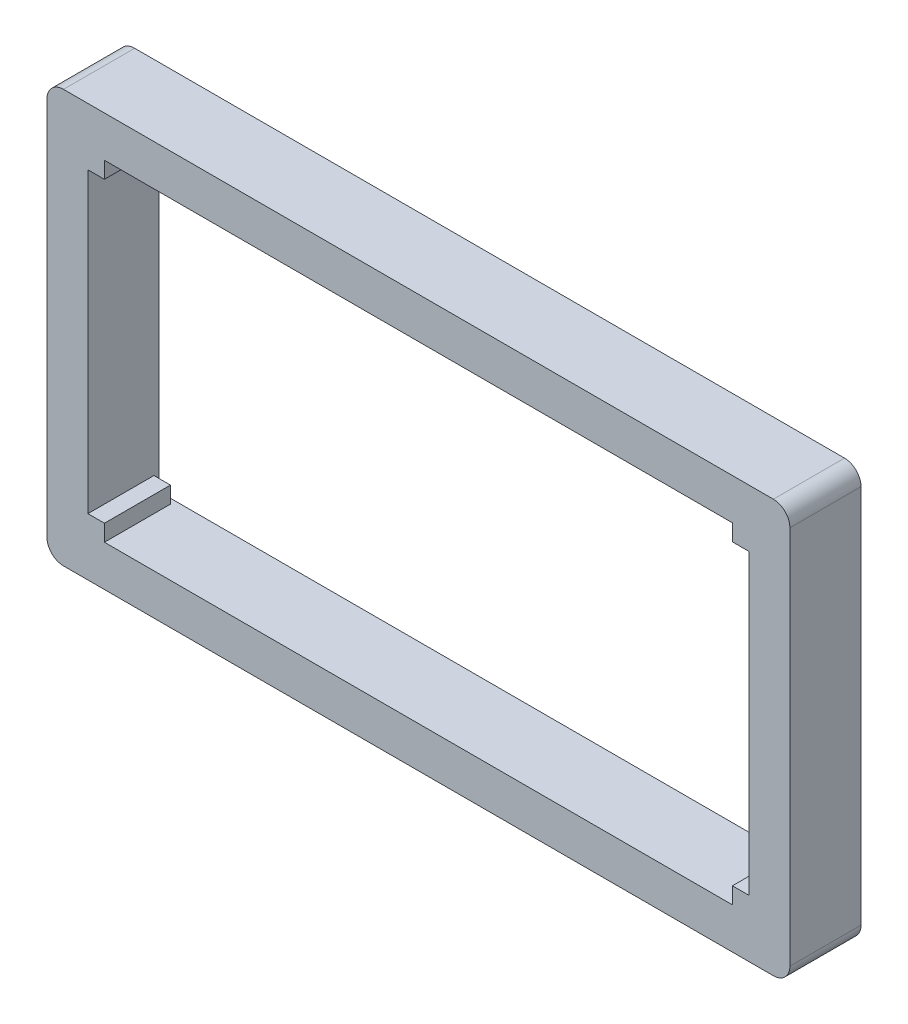
ISO-10303-21;
HEADER;
FILE_DESCRIPTION(('STEP AP214'),'2;1');
FILE_NAME('part.step','',(''),(''),'','','');
FILE_SCHEMA(('AUTOMOTIVE_DESIGN { 1 0 10303 214 1 1 1 1 }'));
ENDSEC;
DATA;
#1=APPLICATION_CONTEXT('core data for automotive mechanical design processes');
#2=APPLICATION_PROTOCOL_DEFINITION('international standard','automotive_design',2000,#1);
#3=PRODUCT_CONTEXT('',#1,'mechanical');
#4=PRODUCT('Part','Part','',(#3));
#5=PRODUCT_RELATED_PRODUCT_CATEGORY('part','',(#4));
#6=PRODUCT_DEFINITION_FORMATION('','',#4);
#7=PRODUCT_DEFINITION_CONTEXT('part definition',#1,'design');
#8=PRODUCT_DEFINITION('design','',#6,#7);
#9=PRODUCT_DEFINITION_SHAPE('','',#8);
#10=(LENGTH_UNIT() NAMED_UNIT(*) SI_UNIT(.MILLI.,.METRE.));
#11=(NAMED_UNIT(*) PLANE_ANGLE_UNIT() SI_UNIT($,.RADIAN.));
#12=(NAMED_UNIT(*) SI_UNIT($,.STERADIAN.) SOLID_ANGLE_UNIT());
#13=UNCERTAINTY_MEASURE_WITH_UNIT(LENGTH_MEASURE(1.E-05),#10,'distance_accuracy_value','');
#14=(GEOMETRIC_REPRESENTATION_CONTEXT(3) GLOBAL_UNCERTAINTY_ASSIGNED_CONTEXT((#13)) GLOBAL_UNIT_ASSIGNED_CONTEXT((#10,
#11,#12)) REPRESENTATION_CONTEXT('',''));
#15=CARTESIAN_POINT('',(0.,0.,0.));
#16=DIRECTION('',(0.,0.,1.));
#17=DIRECTION('',(1.,0.,0.));
#18=AXIS2_PLACEMENT_3D('',#15,#16,#17);
#19=CARTESIAN_POINT('',(0.,0.,0.));
#20=DIRECTION('',(0.,0.,1.));
#21=DIRECTION('',(1.,0.,0.));
#22=AXIS2_PLACEMENT_3D('',#19,#20,#21);
#23=PLANE('',#22);
#24=DIRECTION('',(1.,0.,0.));
#25=VECTOR('',#24,1.);
#26=CARTESIAN_POINT('',(-12.4,-12.4,0.));
#27=LINE('',#26,#25);
#28=CARTESIAN_POINT('',(-7.4,-12.4,0.));
#29=VERTEX_POINT('',#28);
#30=CARTESIAN_POINT('',(207.6,-12.4,0.));
#31=VERTEX_POINT('',#30);
#32=EDGE_CURVE('E397',#29,#31,#27,.T.);
#33=ORIENTED_EDGE('',*,*,#32,.F.);
#34=CARTESIAN_POINT('',(-7.4,-7.4,0.));
#35=DIRECTION('',(0.,0.,1.));
#36=DIRECTION('',(1.,0.,0.));
#37=AXIS2_PLACEMENT_3D('',#34,#35,#36);
#38=CIRCLE('',#37,5.);
#39=CARTESIAN_POINT('',(-12.4,-7.4,0.));
#40=VERTEX_POINT('',#39);
#41=EDGE_CURVE('E418',#29,#40,#38,.F.);
#42=ORIENTED_EDGE('',*,*,#41,.T.);
#43=DIRECTION('',(0.,-1.,0.));
#44=VECTOR('',#43,1.);
#45=CARTESIAN_POINT('',(-12.4,112.6,0.));
#46=LINE('',#45,#44);
#47=CARTESIAN_POINT('',(-12.4,107.6,0.));
#48=VERTEX_POINT('',#47);
#49=EDGE_CURVE('E391',#48,#40,#46,.T.);
#50=ORIENTED_EDGE('',*,*,#49,.F.);
#51=CARTESIAN_POINT('',(-7.4,107.6,0.));
#52=DIRECTION('',(0.,0.,1.));
#53=DIRECTION('',(1.,0.,0.));
#54=AXIS2_PLACEMENT_3D('',#51,#52,#53);
#55=CIRCLE('',#54,5.);
#56=CARTESIAN_POINT('',(-7.4,112.6,0.));
#57=VERTEX_POINT('',#56);
#58=EDGE_CURVE('E412',#48,#57,#55,.F.);
#59=ORIENTED_EDGE('',*,*,#58,.T.);
#60=DIRECTION('',(-1.,0.,0.));
#61=VECTOR('',#60,1.);
#62=CARTESIAN_POINT('',(-12.4,112.6,0.));
#63=LINE('',#62,#61);
#64=CARTESIAN_POINT('',(207.6,112.6,0.));
#65=VERTEX_POINT('',#64);
#66=EDGE_CURVE('E405',#65,#57,#63,.T.);
#67=ORIENTED_EDGE('',*,*,#66,.F.);
#68=CARTESIAN_POINT('',(207.6,107.6,0.));
#69=DIRECTION('',(0.,0.,1.));
#70=DIRECTION('',(1.,0.,0.));
#71=AXIS2_PLACEMENT_3D('',#68,#69,#70);
#72=CIRCLE('',#71,5.);
#73=CARTESIAN_POINT('',(212.6,107.6,0.));
#74=VERTEX_POINT('',#73);
#75=EDGE_CURVE('E408',#65,#74,#72,.F.);
#76=ORIENTED_EDGE('',*,*,#75,.T.);
#77=DIRECTION('',(0.,1.,0.));
#78=VECTOR('',#77,1.);
#79=CARTESIAN_POINT('',(212.6,112.6,0.));
#80=LINE('',#79,#78);
#81=CARTESIAN_POINT('',(212.6,-7.40000000000002,0.));
#82=VERTEX_POINT('',#81);
#83=EDGE_CURVE('E400',#82,#74,#80,.T.);
#84=ORIENTED_EDGE('',*,*,#83,.F.);
#85=CARTESIAN_POINT('',(207.6,-7.40000000000002,0.));
#86=DIRECTION('',(0.,0.,1.));
#87=DIRECTION('',(1.,0.,0.));
#88=AXIS2_PLACEMENT_3D('',#85,#86,#87);
#89=CIRCLE('',#88,5.);
#90=EDGE_CURVE('E413',#82,#31,#89,.F.);
#91=ORIENTED_EDGE('',*,*,#90,.T.);
#92=EDGE_LOOP('',(#33,#42,#50,#59,#67,#76,#84,#91));
#93=FACE_BOUND('',#92,.T.);
#94=DIRECTION('',(0.,-1.,0.));
#95=VECTOR('',#94,1.);
#96=CARTESIAN_POINT('',(0.,0.,0.));
#97=LINE('',#96,#95);
#98=CARTESIAN_POINT('',(0.,100.2,0.));
#99=VERTEX_POINT('',#98);
#100=CARTESIAN_POINT('',(0.,0.,0.));
#101=VERTEX_POINT('',#100);
#102=EDGE_CURVE('E329',#99,#101,#97,.T.);
#103=ORIENTED_EDGE('',*,*,#102,.T.);
#104=DIRECTION('',(1.,0.,0.));
#105=VECTOR('',#104,1.);
#106=CARTESIAN_POINT('',(0.,0.,0.));
#107=LINE('',#106,#105);
#108=CARTESIAN_POINT('',(200.2,0.,0.));
#109=VERTEX_POINT('',#108);
#110=EDGE_CURVE('E376',#101,#109,#107,.T.);
#111=ORIENTED_EDGE('',*,*,#110,.T.);
#112=DIRECTION('',(0.,1.,0.));
#113=VECTOR('',#112,1.);
#114=CARTESIAN_POINT('',(200.2,0.,0.));
#115=LINE('',#114,#113);
#116=CARTESIAN_POINT('',(200.2,100.2,0.));
#117=VERTEX_POINT('',#116);
#118=EDGE_CURVE('E377',#109,#117,#115,.T.);
#119=ORIENTED_EDGE('',*,*,#118,.T.);
#120=DIRECTION('',(-1.,0.,0.));
#121=VECTOR('',#120,1.);
#122=CARTESIAN_POINT('',(0.,100.2,0.));
#123=LINE('',#122,#121);
#124=EDGE_CURVE('E385',#117,#99,#123,.T.);
#125=ORIENTED_EDGE('',*,*,#124,.T.);
#126=EDGE_LOOP('',(#103,#111,#119,#125));
#127=FACE_BOUND('',#126,.T.);
#128=ADVANCED_FACE('F90',(#93,#127),#23,.F.);
#129=CARTESIAN_POINT('',(-12.4,112.6,1.55));
#130=DIRECTION('',(1.,0.,0.));
#131=DIRECTION('',(0.,0.,-1.));
#132=AXIS2_PLACEMENT_3D('',#129,#130,#131);
#133=PLANE('',#132);
#134=ORIENTED_EDGE('',*,*,#49,.T.);
#135=DIRECTION('',(0.,0.,-1.));
#136=VECTOR('',#135,1.);
#137=CARTESIAN_POINT('',(-12.4,-7.4,1.55));
#138=LINE('',#137,#136);
#139=CARTESIAN_POINT('',(-12.4,-7.4,21.55));
#140=VERTEX_POINT('',#139);
#141=EDGE_CURVE('E423',#40,#140,#138,.F.);
#142=ORIENTED_EDGE('',*,*,#141,.T.);
#143=DIRECTION('',(0.,-1.,0.));
#144=VECTOR('',#143,1.);
#145=CARTESIAN_POINT('',(-12.4,0.,21.55));
#146=LINE('',#145,#144);
#147=CARTESIAN_POINT('',(-12.4,107.6,21.55));
#148=VERTEX_POINT('',#147);
#149=EDGE_CURVE('E296',#148,#140,#146,.T.);
#150=ORIENTED_EDGE('',*,*,#149,.F.);
#151=DIRECTION('',(0.,0.,-1.));
#152=VECTOR('',#151,1.);
#153=CARTESIAN_POINT('',(-12.4,107.6,1.55));
#154=LINE('',#153,#152);
#155=EDGE_CURVE('E416',#148,#48,#154,.T.);
#156=ORIENTED_EDGE('',*,*,#155,.T.);
#157=EDGE_LOOP('',(#134,#142,#150,#156));
#158=FACE_BOUND('',#157,.T.);
#159=ADVANCED_FACE('F454',(#158),#133,.F.);
#160=CARTESIAN_POINT('',(-12.4,-12.4,1.55));
#161=DIRECTION('',(0.,1.,0.));
#162=DIRECTION('',(-1.,0.,0.));
#163=AXIS2_PLACEMENT_3D('',#160,#161,#162);
#164=PLANE('',#163);
#165=DIRECTION('',(1.,0.,0.));
#166=VECTOR('',#165,1.);
#167=CARTESIAN_POINT('',(0.,-12.4,21.55));
#168=LINE('',#167,#166);
#169=CARTESIAN_POINT('',(-7.4,-12.4,21.55));
#170=VERTEX_POINT('',#169);
#171=CARTESIAN_POINT('',(207.6,-12.4,21.55));
#172=VERTEX_POINT('',#171);
#173=EDGE_CURVE('E302',#170,#172,#168,.T.);
#174=ORIENTED_EDGE('',*,*,#173,.F.);
#175=DIRECTION('',(0.,0.,-1.));
#176=VECTOR('',#175,1.);
#177=CARTESIAN_POINT('',(-7.4,-12.4,1.55));
#178=LINE('',#177,#176);
#179=EDGE_CURVE('E410',#170,#29,#178,.T.);
#180=ORIENTED_EDGE('',*,*,#179,.T.);
#181=ORIENTED_EDGE('',*,*,#32,.T.);
#182=DIRECTION('',(0.,0.,-1.));
#183=VECTOR('',#182,1.);
#184=CARTESIAN_POINT('',(207.6,-12.4,1.55));
#185=LINE('',#184,#183);
#186=EDGE_CURVE('E403',#31,#172,#185,.F.);
#187=ORIENTED_EDGE('',*,*,#186,.T.);
#188=EDGE_LOOP('',(#174,#180,#181,#187));
#189=FACE_BOUND('',#188,.T.);
#190=ADVANCED_FACE('F462',(#189),#164,.F.);
#191=CARTESIAN_POINT('',(212.6,112.6,1.55));
#192=DIRECTION('',(-1.,0.,0.));
#193=DIRECTION('',(0.,0.,1.));
#194=AXIS2_PLACEMENT_3D('',#191,#192,#193);
#195=PLANE('',#194);
#196=DIRECTION('',(0.,1.,0.));
#197=VECTOR('',#196,1.);
#198=CARTESIAN_POINT('',(212.6,0.,21.55));
#199=LINE('',#198,#197);
#200=CARTESIAN_POINT('',(212.6,-7.40000000000002,21.55));
#201=VERTEX_POINT('',#200);
#202=CARTESIAN_POINT('',(212.6,107.6,21.55));
#203=VERTEX_POINT('',#202);
#204=EDGE_CURVE('E303',#201,#203,#199,.T.);
#205=ORIENTED_EDGE('',*,*,#204,.F.);
#206=DIRECTION('',(0.,0.,-1.));
#207=VECTOR('',#206,1.);
#208=CARTESIAN_POINT('',(212.6,-7.40000000000002,1.55));
#209=LINE('',#208,#207);
#210=EDGE_CURVE('E431',#201,#82,#209,.T.);
#211=ORIENTED_EDGE('',*,*,#210,.T.);
#212=ORIENTED_EDGE('',*,*,#83,.T.);
#213=DIRECTION('',(0.,0.,-1.));
#214=VECTOR('',#213,1.);
#215=CARTESIAN_POINT('',(212.6,107.6,1.55));
#216=LINE('',#215,#214);
#217=EDGE_CURVE('E102',#74,#203,#216,.F.);
#218=ORIENTED_EDGE('',*,*,#217,.T.);
#219=EDGE_LOOP('',(#205,#211,#212,#218));
#220=FACE_BOUND('',#219,.T.);
#221=ADVANCED_FACE('F466',(#220),#195,.F.);
#222=CARTESIAN_POINT('',(-12.4,112.6,1.55));
#223=DIRECTION('',(0.,-1.,0.));
#224=DIRECTION('',(1.,0.,0.));
#225=AXIS2_PLACEMENT_3D('',#222,#223,#224);
#226=PLANE('',#225);
#227=ORIENTED_EDGE('',*,*,#66,.T.);
#228=DIRECTION('',(0.,0.,-1.));
#229=VECTOR('',#228,1.);
#230=CARTESIAN_POINT('',(-7.4,112.6,1.55));
#231=LINE('',#230,#229);
#232=CARTESIAN_POINT('',(-7.4,112.6,21.55));
#233=VERTEX_POINT('',#232);
#234=EDGE_CURVE('E12',#57,#233,#231,.F.);
#235=ORIENTED_EDGE('',*,*,#234,.T.);
#236=DIRECTION('',(-1.,0.,0.));
#237=VECTOR('',#236,1.);
#238=CARTESIAN_POINT('',(0.,112.6,21.55));
#239=LINE('',#238,#237);
#240=CARTESIAN_POINT('',(207.6,112.6,21.55));
#241=VERTEX_POINT('',#240);
#242=EDGE_CURVE('E297',#241,#233,#239,.T.);
#243=ORIENTED_EDGE('',*,*,#242,.F.);
#244=DIRECTION('',(0.,0.,-1.));
#245=VECTOR('',#244,1.);
#246=CARTESIAN_POINT('',(207.6,112.6,1.55));
#247=LINE('',#246,#245);
#248=EDGE_CURVE('E100',#241,#65,#247,.T.);
#249=ORIENTED_EDGE('',*,*,#248,.T.);
#250=EDGE_LOOP('',(#227,#235,#243,#249));
#251=FACE_BOUND('',#250,.T.);
#252=ADVANCED_FACE('F437',(#251),#226,.F.);
#253=CARTESIAN_POINT('',(0.,0.,1.55));
#254=DIRECTION('',(1.,0.,0.));
#255=DIRECTION('',(0.,0.,-1.));
#256=AXIS2_PLACEMENT_3D('',#253,#254,#255);
#257=PLANE('',#256);
#258=ORIENTED_EDGE('',*,*,#102,.F.);
#259=DIRECTION('',(0.,0.,-1.));
#260=VECTOR('',#259,1.);
#261=CARTESIAN_POINT('',(0.,100.2,1.55));
#262=LINE('',#261,#260);
#263=CARTESIAN_POINT('',(0.,100.2,1.55));
#264=VERTEX_POINT('',#263);
#265=EDGE_CURVE('E373',#264,#99,#262,.T.);
#266=ORIENTED_EDGE('',*,*,#265,.F.);
#267=DIRECTION('',(0.,-1.,0.));
#268=VECTOR('',#267,1.);
#269=CARTESIAN_POINT('',(0.,0.,1.55));
#270=LINE('',#269,#268);
#271=CARTESIAN_POINT('',(0.,95.2,1.55));
#272=VERTEX_POINT('',#271);
#273=EDGE_CURVE('E359',#264,#272,#270,.T.);
#274=ORIENTED_EDGE('',*,*,#273,.T.);
#275=DIRECTION('',(0.,0.,-1.));
#276=VECTOR('',#275,1.);
#277=CARTESIAN_POINT('',(0.,95.2,21.55));
#278=LINE('',#277,#276);
#279=CARTESIAN_POINT('',(0.,95.2,21.55));
#280=VERTEX_POINT('',#279);
#281=EDGE_CURVE('E323',#280,#272,#278,.T.);
#282=ORIENTED_EDGE('',*,*,#281,.F.);
#283=DIRECTION('',(0.,1.,0.));
#284=VECTOR('',#283,1.);
#285=CARTESIAN_POINT('',(0.,0.,21.55));
#286=LINE('',#285,#284);
#287=CARTESIAN_POINT('',(0.,4.99999999999998,21.55));
#288=VERTEX_POINT('',#287);
#289=EDGE_CURVE('E290',#288,#280,#286,.T.);
#290=ORIENTED_EDGE('',*,*,#289,.F.);
#291=DIRECTION('',(0.,0.,-1.));
#292=VECTOR('',#291,1.);
#293=CARTESIAN_POINT('',(0.,4.99999999999998,21.55));
#294=LINE('',#293,#292);
#295=CARTESIAN_POINT('',(0.,4.99999999999998,1.55));
#296=VERTEX_POINT('',#295);
#297=EDGE_CURVE('E324',#288,#296,#294,.T.);
#298=ORIENTED_EDGE('',*,*,#297,.T.);
#299=CARTESIAN_POINT('',(0.,0.,1.55));
#300=VERTEX_POINT('',#299);
#301=EDGE_CURVE('E362',#296,#300,#270,.T.);
#302=ORIENTED_EDGE('',*,*,#301,.T.);
#303=DIRECTION('',(0.,0.,-1.));
#304=VECTOR('',#303,1.);
#305=CARTESIAN_POINT('',(0.,0.,1.55));
#306=LINE('',#305,#304);
#307=EDGE_CURVE('E392',#300,#101,#306,.T.);
#308=ORIENTED_EDGE('',*,*,#307,.T.);
#309=EDGE_LOOP('',(#258,#266,#274,#282,#290,#298,#302,#308));
#310=FACE_BOUND('',#309,.T.);
#311=ADVANCED_FACE('F477',(#310),#257,.T.);
#312=CARTESIAN_POINT('',(0.,0.,1.55));
#313=DIRECTION('',(0.,1.,0.));
#314=DIRECTION('',(0.,0.,1.));
#315=AXIS2_PLACEMENT_3D('',#312,#313,#314);
#316=PLANE('',#315);
#317=ORIENTED_EDGE('',*,*,#110,.F.);
#318=ORIENTED_EDGE('',*,*,#307,.F.);
#319=DIRECTION('',(1.,0.,0.));
#320=VECTOR('',#319,1.);
#321=CARTESIAN_POINT('',(0.,0.,1.55));
#322=LINE('',#321,#320);
#323=CARTESIAN_POINT('',(5.00000000000002,0.,1.55));
#324=VERTEX_POINT('',#323);
#325=EDGE_CURVE('E361',#300,#324,#322,.T.);
#326=ORIENTED_EDGE('',*,*,#325,.T.);
#327=DIRECTION('',(0.,0.,-1.));
#328=VECTOR('',#327,1.);
#329=CARTESIAN_POINT('',(5.00000000000002,0.,21.55));
#330=LINE('',#329,#328);
#331=CARTESIAN_POINT('',(5.00000000000003,0.,21.55));
#332=VERTEX_POINT('',#331);
#333=EDGE_CURVE('E327',#332,#324,#330,.T.);
#334=ORIENTED_EDGE('',*,*,#333,.F.);
#335=DIRECTION('',(-1.,0.,0.));
#336=VECTOR('',#335,1.);
#337=CARTESIAN_POINT('',(0.,0.,21.55));
#338=LINE('',#337,#336);
#339=CARTESIAN_POINT('',(195.2,0.,21.55));
#340=VERTEX_POINT('',#339);
#341=EDGE_CURVE('E287',#340,#332,#338,.T.);
#342=ORIENTED_EDGE('',*,*,#341,.F.);
#343=DIRECTION('',(0.,0.,-1.));
#344=VECTOR('',#343,1.);
#345=CARTESIAN_POINT('',(195.2,0.,21.55));
#346=LINE('',#345,#344);
#347=CARTESIAN_POINT('',(195.2,0.,1.55));
#348=VERTEX_POINT('',#347);
#349=EDGE_CURVE('E320',#340,#348,#346,.T.);
#350=ORIENTED_EDGE('',*,*,#349,.T.);
#351=CARTESIAN_POINT('',(200.2,0.,1.55));
#352=VERTEX_POINT('',#351);
#353=EDGE_CURVE('E363',#348,#352,#322,.T.);
#354=ORIENTED_EDGE('',*,*,#353,.T.);
#355=DIRECTION('',(0.,0.,-1.));
#356=VECTOR('',#355,1.);
#357=CARTESIAN_POINT('',(200.2,0.,1.55));
#358=LINE('',#357,#356);
#359=EDGE_CURVE('E386',#352,#109,#358,.T.);
#360=ORIENTED_EDGE('',*,*,#359,.T.);
#361=EDGE_LOOP('',(#317,#318,#326,#334,#342,#350,#354,#360));
#362=FACE_BOUND('',#361,.T.);
#363=ADVANCED_FACE('F647',(#362),#316,.T.);
#364=CARTESIAN_POINT('',(200.2,0.,1.55));
#365=DIRECTION('',(-1.,0.,0.));
#366=DIRECTION('',(0.,0.,1.));
#367=AXIS2_PLACEMENT_3D('',#364,#365,#366);
#368=PLANE('',#367);
#369=ORIENTED_EDGE('',*,*,#118,.F.);
#370=ORIENTED_EDGE('',*,*,#359,.F.);
#371=DIRECTION('',(0.,1.,0.));
#372=VECTOR('',#371,1.);
#373=CARTESIAN_POINT('',(200.2,0.,1.55));
#374=LINE('',#373,#372);
#375=CARTESIAN_POINT('',(200.2,5.,1.55));
#376=VERTEX_POINT('',#375);
#377=EDGE_CURVE('E370',#352,#376,#374,.T.);
#378=ORIENTED_EDGE('',*,*,#377,.T.);
#379=DIRECTION('',(0.,0.,-1.));
#380=VECTOR('',#379,1.);
#381=CARTESIAN_POINT('',(200.2,5.,21.55));
#382=LINE('',#381,#380);
#383=CARTESIAN_POINT('',(200.2,5.,21.55));
#384=VERTEX_POINT('',#383);
#385=EDGE_CURVE('E265',#384,#376,#382,.T.);
#386=ORIENTED_EDGE('',*,*,#385,.F.);
#387=DIRECTION('',(0.,-1.,0.));
#388=VECTOR('',#387,1.);
#389=CARTESIAN_POINT('',(200.2,0.,21.55));
#390=LINE('',#389,#388);
#391=CARTESIAN_POINT('',(200.2,95.2,21.55));
#392=VERTEX_POINT('',#391);
#393=EDGE_CURVE('E264',#392,#384,#390,.T.);
#394=ORIENTED_EDGE('',*,*,#393,.F.);
#395=DIRECTION('',(0.,0.,-1.));
#396=VECTOR('',#395,1.);
#397=CARTESIAN_POINT('',(200.2,95.2,21.55));
#398=LINE('',#397,#396);
#399=CARTESIAN_POINT('',(200.2,95.2,1.55));
#400=VERTEX_POINT('',#399);
#401=EDGE_CURVE('E252',#392,#400,#398,.T.);
#402=ORIENTED_EDGE('',*,*,#401,.T.);
#403=CARTESIAN_POINT('',(200.2,100.2,1.55));
#404=VERTEX_POINT('',#403);
#405=EDGE_CURVE('E368',#400,#404,#374,.T.);
#406=ORIENTED_EDGE('',*,*,#405,.T.);
#407=DIRECTION('',(0.,0.,-1.));
#408=VECTOR('',#407,1.);
#409=CARTESIAN_POINT('',(200.2,100.2,1.55));
#410=LINE('',#409,#408);
#411=EDGE_CURVE('E390',#404,#117,#410,.T.);
#412=ORIENTED_EDGE('',*,*,#411,.T.);
#413=EDGE_LOOP('',(#369,#370,#378,#386,#394,#402,#406,#412));
#414=FACE_BOUND('',#413,.T.);
#415=ADVANCED_FACE('F270',(#414),#368,.T.);
#416=CARTESIAN_POINT('',(0.,100.2,1.55));
#417=DIRECTION('',(0.,-1.,0.));
#418=DIRECTION('',(0.,0.,-1.));
#419=AXIS2_PLACEMENT_3D('',#416,#417,#418);
#420=PLANE('',#419);
#421=ORIENTED_EDGE('',*,*,#124,.F.);
#422=ORIENTED_EDGE('',*,*,#411,.F.);
#423=DIRECTION('',(-1.,0.,0.));
#424=VECTOR('',#423,1.);
#425=CARTESIAN_POINT('',(0.,100.2,1.55));
#426=LINE('',#425,#424);
#427=CARTESIAN_POINT('',(195.2,100.2,1.55));
#428=VERTEX_POINT('',#427);
#429=EDGE_CURVE('E367',#404,#428,#426,.T.);
#430=ORIENTED_EDGE('',*,*,#429,.T.);
#431=DIRECTION('',(0.,0.,-1.));
#432=VECTOR('',#431,1.);
#433=CARTESIAN_POINT('',(195.2,100.2,21.55));
#434=LINE('',#433,#432);
#435=CARTESIAN_POINT('',(195.2,100.2,21.55));
#436=VERTEX_POINT('',#435);
#437=EDGE_CURVE('E312',#436,#428,#434,.T.);
#438=ORIENTED_EDGE('',*,*,#437,.F.);
#439=DIRECTION('',(1.,0.,0.));
#440=VECTOR('',#439,1.);
#441=CARTESIAN_POINT('',(0.,100.2,21.55));
#442=LINE('',#441,#440);
#443=CARTESIAN_POINT('',(5.00000000000001,100.2,21.55));
#444=VERTEX_POINT('',#443);
#445=EDGE_CURVE('E291',#444,#436,#442,.T.);
#446=ORIENTED_EDGE('',*,*,#445,.F.);
#447=DIRECTION('',(0.,0.,-1.));
#448=VECTOR('',#447,1.);
#449=CARTESIAN_POINT('',(5.00000000000001,100.2,21.55));
#450=LINE('',#449,#448);
#451=CARTESIAN_POINT('',(5.00000000000001,100.2,1.55));
#452=VERTEX_POINT('',#451);
#453=EDGE_CURVE('E261',#444,#452,#450,.T.);
#454=ORIENTED_EDGE('',*,*,#453,.T.);
#455=EDGE_CURVE('E369',#452,#264,#426,.T.);
#456=ORIENTED_EDGE('',*,*,#455,.T.);
#457=ORIENTED_EDGE('',*,*,#265,.T.);
#458=EDGE_LOOP('',(#421,#422,#430,#438,#446,#454,#456,#457));
#459=FACE_BOUND('',#458,.T.);
#460=ADVANCED_FACE('F626',(#459),#420,.T.);
#461=CARTESIAN_POINT('',(0.,0.,1.55));
#462=DIRECTION('',(0.,0.,1.));
#463=DIRECTION('',(1.,0.,0.));
#464=AXIS2_PLACEMENT_3D('',#461,#462,#463);
#465=PLANE('',#464);
#466=ORIENTED_EDGE('',*,*,#325,.F.);
#467=ORIENTED_EDGE('',*,*,#301,.F.);
#468=DIRECTION('',(1.,0.,0.));
#469=VECTOR('',#468,1.);
#470=CARTESIAN_POINT('',(0.,4.99999999999998,1.55));
#471=LINE('',#470,#469);
#472=CARTESIAN_POINT('',(5.00000000000003,4.99999999999998,1.55));
#473=VERTEX_POINT('',#472);
#474=EDGE_CURVE('E340',#296,#473,#471,.T.);
#475=ORIENTED_EDGE('',*,*,#474,.T.);
#476=DIRECTION('',(0.,1.,0.));
#477=VECTOR('',#476,1.);
#478=CARTESIAN_POINT('',(5.00000000000002,0.,1.55));
#479=LINE('',#478,#477);
#480=EDGE_CURVE('E333',#324,#473,#479,.T.);
#481=ORIENTED_EDGE('',*,*,#480,.F.);
#482=EDGE_LOOP('',(#466,#467,#475,#481));
#483=FACE_BOUND('',#482,.T.);
#484=ADVANCED_FACE('F566',(#483),#465,.F.);
#485=ORIENTED_EDGE('',*,*,#273,.F.);
#486=ORIENTED_EDGE('',*,*,#455,.F.);
#487=DIRECTION('',(0.,-1.,0.));
#488=VECTOR('',#487,1.);
#489=CARTESIAN_POINT('',(5.00000000000001,100.2,1.55));
#490=LINE('',#489,#488);
#491=CARTESIAN_POINT('',(5.00000000000001,95.2,1.55));
#492=VERTEX_POINT('',#491);
#493=EDGE_CURVE('E350',#452,#492,#490,.T.);
#494=ORIENTED_EDGE('',*,*,#493,.T.);
#495=DIRECTION('',(1.,0.,0.));
#496=VECTOR('',#495,1.);
#497=CARTESIAN_POINT('',(0.,95.2,1.55));
#498=LINE('',#497,#496);
#499=EDGE_CURVE('E348',#272,#492,#498,.T.);
#500=ORIENTED_EDGE('',*,*,#499,.F.);
#501=EDGE_LOOP('',(#485,#486,#494,#500));
#502=FACE_BOUND('',#501,.T.);
#503=ADVANCED_FACE('F608',(#502),#465,.F.);
#504=ORIENTED_EDGE('',*,*,#353,.F.);
#505=DIRECTION('',(0.,1.,0.));
#506=VECTOR('',#505,1.);
#507=CARTESIAN_POINT('',(195.2,0.,1.55));
#508=LINE('',#507,#506);
#509=CARTESIAN_POINT('',(195.2,5.,1.55));
#510=VERTEX_POINT('',#509);
#511=EDGE_CURVE('E278',#348,#510,#508,.T.);
#512=ORIENTED_EDGE('',*,*,#511,.T.);
#513=DIRECTION('',(-1.,0.,0.));
#514=VECTOR('',#513,1.);
#515=CARTESIAN_POINT('',(0.,5.,1.55));
#516=LINE('',#515,#514);
#517=EDGE_CURVE('E306',#376,#510,#516,.T.);
#518=ORIENTED_EDGE('',*,*,#517,.F.);
#519=ORIENTED_EDGE('',*,*,#377,.F.);
#520=EDGE_LOOP('',(#504,#512,#518,#519));
#521=FACE_BOUND('',#520,.T.);
#522=ADVANCED_FACE('F548',(#521),#465,.F.);
#523=CARTESIAN_POINT('',(0.,5.,21.55));
#524=DIRECTION('',(0.,-1.,0.));
#525=DIRECTION('',(0.,0.,-1.));
#526=AXIS2_PLACEMENT_3D('',#523,#524,#525);
#527=PLANE('',#526);
#528=ORIENTED_EDGE('',*,*,#517,.T.);
#529=DIRECTION('',(0.,0.,-1.));
#530=VECTOR('',#529,1.);
#531=CARTESIAN_POINT('',(195.2,5.,21.55));
#532=LINE('',#531,#530);
#533=CARTESIAN_POINT('',(195.2,5.,21.55));
#534=VERTEX_POINT('',#533);
#535=EDGE_CURVE('E319',#534,#510,#532,.T.);
#536=ORIENTED_EDGE('',*,*,#535,.F.);
#537=DIRECTION('',(-1.,0.,0.));
#538=VECTOR('',#537,1.);
#539=CARTESIAN_POINT('',(0.,5.,21.55));
#540=LINE('',#539,#538);
#541=EDGE_CURVE('E271',#384,#534,#540,.T.);
#542=ORIENTED_EDGE('',*,*,#541,.F.);
#543=ORIENTED_EDGE('',*,*,#385,.T.);
#544=EDGE_LOOP('',(#528,#536,#542,#543));
#545=FACE_BOUND('',#544,.T.);
#546=ADVANCED_FACE('F539',(#545),#527,.F.);
#547=CARTESIAN_POINT('',(195.2,0.,21.55));
#548=DIRECTION('',(-1.,0.,0.));
#549=DIRECTION('',(0.,0.,1.));
#550=AXIS2_PLACEMENT_3D('',#547,#548,#549);
#551=PLANE('',#550);
#552=ORIENTED_EDGE('',*,*,#511,.F.);
#553=ORIENTED_EDGE('',*,*,#349,.F.);
#554=DIRECTION('',(0.,1.,0.));
#555=VECTOR('',#554,1.);
#556=CARTESIAN_POINT('',(195.2,0.,21.55));
#557=LINE('',#556,#555);
#558=EDGE_CURVE('E281',#340,#534,#557,.T.);
#559=ORIENTED_EDGE('',*,*,#558,.T.);
#560=ORIENTED_EDGE('',*,*,#535,.T.);
#561=EDGE_LOOP('',(#552,#553,#559,#560));
#562=FACE_BOUND('',#561,.T.);
#563=ADVANCED_FACE('F585',(#562),#551,.T.);
#564=CARTESIAN_POINT('',(195.2,0.,21.55));
#565=DIRECTION('',(1.,0.,0.));
#566=DIRECTION('',(0.,0.,-1.));
#567=AXIS2_PLACEMENT_3D('',#564,#565,#566);
#568=PLANE('',#567);
#569=DIRECTION('',(0.,-1.,0.));
#570=VECTOR('',#569,1.);
#571=CARTESIAN_POINT('',(195.2,0.,1.55));
#572=LINE('',#571,#570);
#573=CARTESIAN_POINT('',(195.2,95.2,1.55));
#574=VERTEX_POINT('',#573);
#575=EDGE_CURVE('E280',#428,#574,#572,.T.);
#576=ORIENTED_EDGE('',*,*,#575,.T.);
#577=DIRECTION('',(0.,0.,-1.));
#578=VECTOR('',#577,1.);
#579=CARTESIAN_POINT('',(195.2,95.2,21.55));
#580=LINE('',#579,#578);
#581=CARTESIAN_POINT('',(195.2,95.2,21.55));
#582=VERTEX_POINT('',#581);
#583=EDGE_CURVE('E308',#582,#574,#580,.T.);
#584=ORIENTED_EDGE('',*,*,#583,.F.);
#585=DIRECTION('',(0.,-1.,0.));
#586=VECTOR('',#585,1.);
#587=CARTESIAN_POINT('',(195.2,0.,21.55));
#588=LINE('',#587,#586);
#589=EDGE_CURVE('E274',#436,#582,#588,.T.);
#590=ORIENTED_EDGE('',*,*,#589,.F.);
#591=ORIENTED_EDGE('',*,*,#437,.T.);
#592=EDGE_LOOP('',(#576,#584,#590,#591));
#593=FACE_BOUND('',#592,.T.);
#594=ADVANCED_FACE('F576',(#593),#568,.F.);
#595=CARTESIAN_POINT('',(0.,95.2,21.55));
#596=DIRECTION('',(0.,-1.,0.));
#597=DIRECTION('',(0.,0.,-1.));
#598=AXIS2_PLACEMENT_3D('',#595,#596,#597);
#599=PLANE('',#598);
#600=DIRECTION('',(-1.,0.,0.));
#601=VECTOR('',#600,1.);
#602=CARTESIAN_POINT('',(0.,95.2,1.55));
#603=LINE('',#602,#601);
#604=EDGE_CURVE('E256',#400,#574,#603,.T.);
#605=ORIENTED_EDGE('',*,*,#604,.F.);
#606=ORIENTED_EDGE('',*,*,#401,.F.);
#607=DIRECTION('',(-1.,0.,0.));
#608=VECTOR('',#607,1.);
#609=CARTESIAN_POINT('',(0.,95.2,21.55));
#610=LINE('',#609,#608);
#611=EDGE_CURVE('E258',#392,#582,#610,.T.);
#612=ORIENTED_EDGE('',*,*,#611,.T.);
#613=ORIENTED_EDGE('',*,*,#583,.T.);
#614=EDGE_LOOP('',(#605,#606,#612,#613));
#615=FACE_BOUND('',#614,.T.);
#616=ADVANCED_FACE('F255',(#615),#599,.T.);
#617=ORIENTED_EDGE('',*,*,#429,.F.);
#618=ORIENTED_EDGE('',*,*,#405,.F.);
#619=ORIENTED_EDGE('',*,*,#604,.T.);
#620=ORIENTED_EDGE('',*,*,#575,.F.);
#621=EDGE_LOOP('',(#617,#618,#619,#620));
#622=FACE_BOUND('',#621,.T.);
#623=ADVANCED_FACE('F557',(#622),#465,.F.);
#624=CARTESIAN_POINT('',(0.,0.,21.55));
#625=DIRECTION('',(0.,0.,1.));
#626=DIRECTION('',(1.,0.,0.));
#627=AXIS2_PLACEMENT_3D('',#624,#625,#626);
#628=PLANE('',#627);
#629=ORIENTED_EDGE('',*,*,#611,.F.);
#630=ORIENTED_EDGE('',*,*,#393,.T.);
#631=ORIENTED_EDGE('',*,*,#541,.T.);
#632=ORIENTED_EDGE('',*,*,#558,.F.);
#633=ORIENTED_EDGE('',*,*,#341,.T.);
#634=DIRECTION('',(0.,1.,0.));
#635=VECTOR('',#634,1.);
#636=CARTESIAN_POINT('',(5.00000000000002,0.,21.55));
#637=LINE('',#636,#635);
#638=CARTESIAN_POINT('',(5.00000000000003,4.99999999999998,21.55));
#639=VERTEX_POINT('',#638);
#640=EDGE_CURVE('E331',#332,#639,#637,.T.);
#641=ORIENTED_EDGE('',*,*,#640,.T.);
#642=DIRECTION('',(1.,0.,0.));
#643=VECTOR('',#642,1.);
#644=CARTESIAN_POINT('',(0.,4.99999999999998,21.55));
#645=LINE('',#644,#643);
#646=EDGE_CURVE('E332',#288,#639,#645,.T.);
#647=ORIENTED_EDGE('',*,*,#646,.F.);
#648=ORIENTED_EDGE('',*,*,#289,.T.);
#649=DIRECTION('',(1.,0.,0.));
#650=VECTOR('',#649,1.);
#651=CARTESIAN_POINT('',(0.,95.2,21.55));
#652=LINE('',#651,#650);
#653=CARTESIAN_POINT('',(5.00000000000001,95.2,21.55));
#654=VERTEX_POINT('',#653);
#655=EDGE_CURVE('E343',#280,#654,#652,.T.);
#656=ORIENTED_EDGE('',*,*,#655,.T.);
#657=DIRECTION('',(0.,-1.,0.));
#658=VECTOR('',#657,1.);
#659=CARTESIAN_POINT('',(5.00000000000001,100.2,21.55));
#660=LINE('',#659,#658);
#661=EDGE_CURVE('E347',#444,#654,#660,.T.);
#662=ORIENTED_EDGE('',*,*,#661,.F.);
#663=ORIENTED_EDGE('',*,*,#445,.T.);
#664=ORIENTED_EDGE('',*,*,#589,.T.);
#665=EDGE_LOOP('',(#629,#630,#631,#632,#633,#641,#647,#648,#656,#662,#663,#664));
#666=FACE_BOUND('',#665,.T.);
#667=ORIENTED_EDGE('',*,*,#149,.T.);
#668=CARTESIAN_POINT('',(-7.4,-7.4,21.55));
#669=DIRECTION('',(0.,0.,1.));
#670=DIRECTION('',(1.,0.,0.));
#671=AXIS2_PLACEMENT_3D('',#668,#669,#670);
#672=CIRCLE('',#671,5.);
#673=EDGE_CURVE('E428',#140,#170,#672,.T.);
#674=ORIENTED_EDGE('',*,*,#673,.T.);
#675=ORIENTED_EDGE('',*,*,#173,.T.);
#676=CARTESIAN_POINT('',(207.6,-7.40000000000002,21.55));
#677=DIRECTION('',(0.,0.,1.));
#678=DIRECTION('',(1.,0.,0.));
#679=AXIS2_PLACEMENT_3D('',#676,#677,#678);
#680=CIRCLE('',#679,5.);
#681=EDGE_CURVE('E112',#172,#201,#680,.T.);
#682=ORIENTED_EDGE('',*,*,#681,.T.);
#683=ORIENTED_EDGE('',*,*,#204,.T.);
#684=CARTESIAN_POINT('',(207.6,107.6,21.55));
#685=DIRECTION('',(0.,0.,1.));
#686=DIRECTION('',(1.,0.,0.));
#687=AXIS2_PLACEMENT_3D('',#684,#685,#686);
#688=CIRCLE('',#687,5.);
#689=EDGE_CURVE('E421',#203,#241,#688,.T.);
#690=ORIENTED_EDGE('',*,*,#689,.T.);
#691=ORIENTED_EDGE('',*,*,#242,.T.);
#692=CARTESIAN_POINT('',(-7.4,107.6,21.55));
#693=DIRECTION('',(0.,0.,1.));
#694=DIRECTION('',(1.,0.,0.));
#695=AXIS2_PLACEMENT_3D('',#692,#693,#694);
#696=CIRCLE('',#695,5.);
#697=EDGE_CURVE('E422',#233,#148,#696,.T.);
#698=ORIENTED_EDGE('',*,*,#697,.T.);
#699=EDGE_LOOP('',(#667,#674,#675,#682,#683,#690,#691,#698));
#700=FACE_BOUND('',#699,.T.);
#701=ADVANCED_FACE('F272',(#666,#700),#628,.T.);
#702=CARTESIAN_POINT('',(0.,95.2,21.55));
#703=DIRECTION('',(0.,1.,0.));
#704=DIRECTION('',(0.,0.,1.));
#705=AXIS2_PLACEMENT_3D('',#702,#703,#704);
#706=PLANE('',#705);
#707=ORIENTED_EDGE('',*,*,#499,.T.);
#708=DIRECTION('',(0.,0.,-1.));
#709=VECTOR('',#708,1.);
#710=CARTESIAN_POINT('',(5.00000000000001,95.2,21.55));
#711=LINE('',#710,#709);
#712=EDGE_CURVE('E338',#654,#492,#711,.T.);
#713=ORIENTED_EDGE('',*,*,#712,.F.);
#714=ORIENTED_EDGE('',*,*,#655,.F.);
#715=ORIENTED_EDGE('',*,*,#281,.T.);
#716=EDGE_LOOP('',(#707,#713,#714,#715));
#717=FACE_BOUND('',#716,.T.);
#718=ADVANCED_FACE('F540',(#717),#706,.F.);
#719=CARTESIAN_POINT('',(5.00000000000001,100.2,21.55));
#720=DIRECTION('',(1.,0.,0.));
#721=DIRECTION('',(0.,0.,-1.));
#722=AXIS2_PLACEMENT_3D('',#719,#720,#721);
#723=PLANE('',#722);
#724=ORIENTED_EDGE('',*,*,#493,.F.);
#725=ORIENTED_EDGE('',*,*,#453,.F.);
#726=ORIENTED_EDGE('',*,*,#661,.T.);
#727=ORIENTED_EDGE('',*,*,#712,.T.);
#728=EDGE_LOOP('',(#724,#725,#726,#727));
#729=FACE_BOUND('',#728,.T.);
#730=ADVANCED_FACE('F526',(#729),#723,.T.);
#731=CARTESIAN_POINT('',(5.00000000000002,0.,21.55));
#732=DIRECTION('',(-1.,0.,0.));
#733=DIRECTION('',(0.,-1.,0.));
#734=AXIS2_PLACEMENT_3D('',#731,#732,#733);
#735=PLANE('',#734);
#736=ORIENTED_EDGE('',*,*,#480,.T.);
#737=DIRECTION('',(0.,0.,-1.));
#738=VECTOR('',#737,1.);
#739=CARTESIAN_POINT('',(5.00000000000003,4.99999999999998,21.55));
#740=LINE('',#739,#738);
#741=EDGE_CURVE('E310',#639,#473,#740,.T.);
#742=ORIENTED_EDGE('',*,*,#741,.F.);
#743=ORIENTED_EDGE('',*,*,#640,.F.);
#744=ORIENTED_EDGE('',*,*,#333,.T.);
#745=EDGE_LOOP('',(#736,#742,#743,#744));
#746=FACE_BOUND('',#745,.T.);
#747=ADVANCED_FACE('F516',(#746),#735,.F.);
#748=CARTESIAN_POINT('',(0.,4.99999999999998,21.55));
#749=DIRECTION('',(0.,1.,0.));
#750=DIRECTION('',(0.,0.,1.));
#751=AXIS2_PLACEMENT_3D('',#748,#749,#750);
#752=PLANE('',#751);
#753=ORIENTED_EDGE('',*,*,#474,.F.);
#754=ORIENTED_EDGE('',*,*,#297,.F.);
#755=ORIENTED_EDGE('',*,*,#646,.T.);
#756=ORIENTED_EDGE('',*,*,#741,.T.);
#757=EDGE_LOOP('',(#753,#754,#755,#756));
#758=FACE_BOUND('',#757,.T.);
#759=ADVANCED_FACE('F489',(#758),#752,.T.);
#760=CARTESIAN_POINT('',(-7.4,-7.4,1.55));
#761=DIRECTION('',(0.,0.,-1.));
#762=DIRECTION('',(-1.,0.,0.));
#763=AXIS2_PLACEMENT_3D('',#760,#761,#762);
#764=CYLINDRICAL_SURFACE('',#763,5.);
#765=ORIENTED_EDGE('',*,*,#673,.F.);
#766=ORIENTED_EDGE('',*,*,#141,.F.);
#767=ORIENTED_EDGE('',*,*,#41,.F.);
#768=ORIENTED_EDGE('',*,*,#179,.F.);
#769=EDGE_LOOP('',(#765,#766,#767,#768));
#770=FACE_BOUND('',#769,.T.);
#771=ADVANCED_FACE('F459',(#770),#764,.T.);
#772=CARTESIAN_POINT('',(207.6,-7.40000000000002,1.55));
#773=DIRECTION('',(0.,0.,-1.));
#774=DIRECTION('',(-1.,0.,0.));
#775=AXIS2_PLACEMENT_3D('',#772,#773,#774);
#776=CYLINDRICAL_SURFACE('',#775,5.);
#777=ORIENTED_EDGE('',*,*,#681,.F.);
#778=ORIENTED_EDGE('',*,*,#186,.F.);
#779=ORIENTED_EDGE('',*,*,#90,.F.);
#780=ORIENTED_EDGE('',*,*,#210,.F.);
#781=EDGE_LOOP('',(#777,#778,#779,#780));
#782=FACE_BOUND('',#781,.T.);
#783=ADVANCED_FACE('F463',(#782),#776,.T.);
#784=CARTESIAN_POINT('',(-7.4,107.6,1.55));
#785=DIRECTION('',(0.,0.,-1.));
#786=DIRECTION('',(-1.,0.,0.));
#787=AXIS2_PLACEMENT_3D('',#784,#785,#786);
#788=CYLINDRICAL_SURFACE('',#787,5.);
#789=ORIENTED_EDGE('',*,*,#697,.F.);
#790=ORIENTED_EDGE('',*,*,#234,.F.);
#791=ORIENTED_EDGE('',*,*,#58,.F.);
#792=ORIENTED_EDGE('',*,*,#155,.F.);
#793=EDGE_LOOP('',(#789,#790,#791,#792));
#794=FACE_BOUND('',#793,.T.);
#795=ADVANCED_FACE('F448',(#794),#788,.T.);
#796=CARTESIAN_POINT('',(207.6,107.6,1.55));
#797=DIRECTION('',(0.,0.,-1.));
#798=DIRECTION('',(-1.,0.,0.));
#799=AXIS2_PLACEMENT_3D('',#796,#797,#798);
#800=CYLINDRICAL_SURFACE('',#799,5.);
#801=ORIENTED_EDGE('',*,*,#689,.F.);
#802=ORIENTED_EDGE('',*,*,#217,.F.);
#803=ORIENTED_EDGE('',*,*,#75,.F.);
#804=ORIENTED_EDGE('',*,*,#248,.F.);
#805=EDGE_LOOP('',(#801,#802,#803,#804));
#806=FACE_BOUND('',#805,.T.);
#807=ADVANCED_FACE('F93',(#806),#800,.T.);
#808=CLOSED_SHELL('',(#128,#159,#190,#221,#252,#311,#363,#415,#460,#484,#503,#522,#546,#563,
#594,#616,#623,#701,#718,#730,#747,#759,#771,#783,#795,#807));
#809=MANIFOLD_SOLID_BREP('B2',#808);
#810=ADVANCED_BREP_SHAPE_REPRESENTATION('',(#18,#809),#14);
#811=SHAPE_DEFINITION_REPRESENTATION(#9,#810);
ENDSEC;
END-ISO-10303-21;
